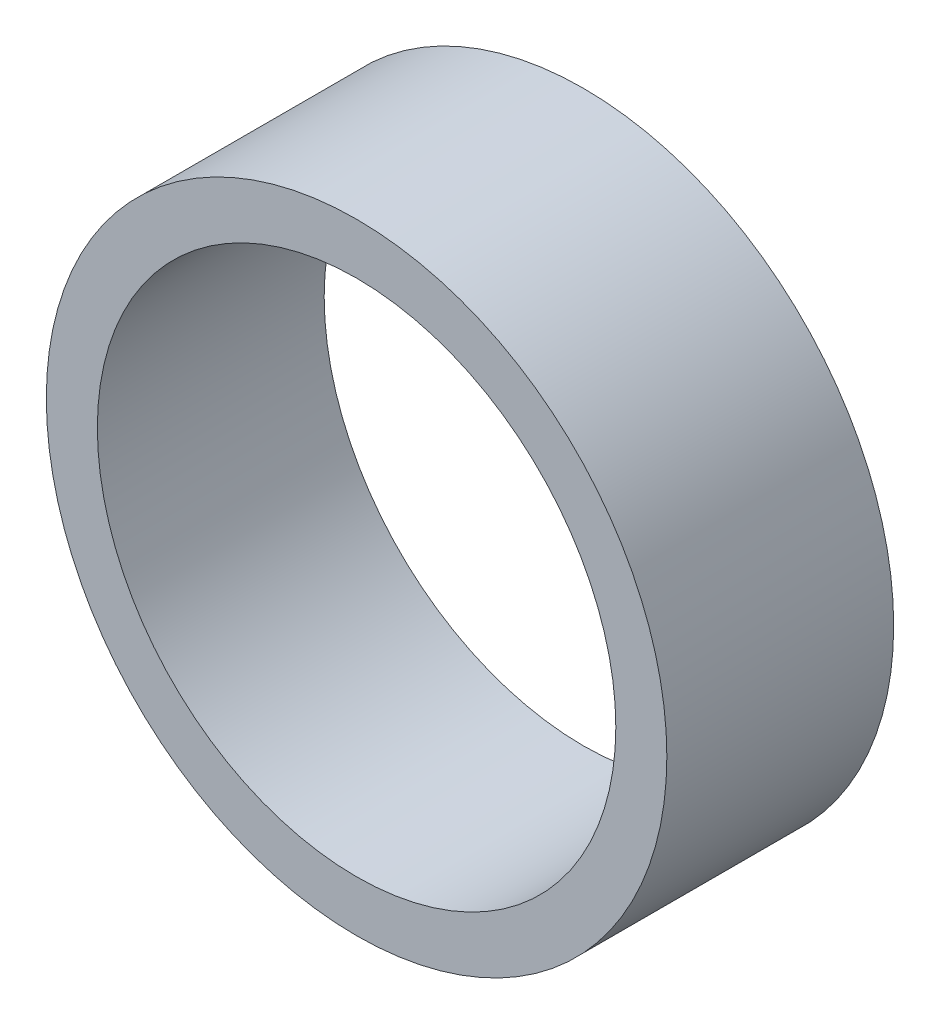
ISO-10303-21;
HEADER;
FILE_DESCRIPTION(('STEP AP214'),'2;1');
FILE_NAME('part.step','',(''),(''),'','','');
FILE_SCHEMA(('AUTOMOTIVE_DESIGN { 1 0 10303 214 1 1 1 1 }'));
ENDSEC;
DATA;
#1=APPLICATION_CONTEXT('core data for automotive mechanical design processes');
#2=APPLICATION_PROTOCOL_DEFINITION('international standard','automotive_design',2000,#1);
#3=PRODUCT_CONTEXT('',#1,'mechanical');
#4=PRODUCT('Part','Part','',(#3));
#5=PRODUCT_RELATED_PRODUCT_CATEGORY('part','',(#4));
#6=PRODUCT_DEFINITION_FORMATION('','',#4);
#7=PRODUCT_DEFINITION_CONTEXT('part definition',#1,'design');
#8=PRODUCT_DEFINITION('design','',#6,#7);
#9=PRODUCT_DEFINITION_SHAPE('','',#8);
#10=(LENGTH_UNIT() NAMED_UNIT(*) SI_UNIT(.MILLI.,.METRE.));
#11=(NAMED_UNIT(*) PLANE_ANGLE_UNIT() SI_UNIT($,.RADIAN.));
#12=(NAMED_UNIT(*) SI_UNIT($,.STERADIAN.) SOLID_ANGLE_UNIT());
#13=UNCERTAINTY_MEASURE_WITH_UNIT(LENGTH_MEASURE(1.E-05),#10,'distance_accuracy_value','');
#14=(GEOMETRIC_REPRESENTATION_CONTEXT(3) GLOBAL_UNCERTAINTY_ASSIGNED_CONTEXT((#13)) GLOBAL_UNIT_ASSIGNED_CONTEXT((#10,
#11,#12)) REPRESENTATION_CONTEXT('',''));
#15=CARTESIAN_POINT('',(0.,0.,0.));
#16=DIRECTION('',(0.,0.,1.));
#17=DIRECTION('',(1.,0.,0.));
#18=AXIS2_PLACEMENT_3D('',#15,#16,#17);
#19=CARTESIAN_POINT('',(0.,0.,17.78));
#20=DIRECTION('',(0.,0.,1.));
#21=DIRECTION('',(1.,0.,0.));
#22=AXIS2_PLACEMENT_3D('',#19,#20,#21);
#23=PLANE('',#22);
#24=CARTESIAN_POINT('',(0.,0.,17.78));
#25=DIRECTION('',(0.,0.,1.));
#26=DIRECTION('',(1.,0.,0.));
#27=AXIS2_PLACEMENT_3D('',#24,#25,#26);
#28=CIRCLE('',#27,24.3205);
#29=CARTESIAN_POINT('',(24.3205,0.,17.78));
#30=VERTEX_POINT('',#29);
#31=EDGE_CURVE('E10',#30,#30,#28,.T.);
#32=ORIENTED_EDGE('',*,*,#31,.T.);
#33=EDGE_LOOP('',(#32));
#34=FACE_BOUND('',#33,.T.);
#35=CARTESIAN_POINT('',(0.,0.,17.78));
#36=DIRECTION('',(0.,0.,1.));
#37=DIRECTION('',(1.,0.,0.));
#38=AXIS2_PLACEMENT_3D('',#35,#36,#37);
#39=CIRCLE('',#38,20.32);
#40=CARTESIAN_POINT('',(20.32,0.,17.78));
#41=VERTEX_POINT('',#40);
#42=EDGE_CURVE('E46',#41,#41,#39,.T.);
#43=ORIENTED_EDGE('',*,*,#42,.F.);
#44=EDGE_LOOP('',(#43));
#45=FACE_BOUND('',#44,.T.);
#46=ADVANCED_FACE('F35',(#34,#45),#23,.T.);
#47=CARTESIAN_POINT('',(0.,0.,0.));
#48=DIRECTION('',(0.,0.,1.));
#49=DIRECTION('',(1.,0.,0.));
#50=AXIS2_PLACEMENT_3D('',#47,#48,#49);
#51=PLANE('',#50);
#52=CARTESIAN_POINT('',(0.,0.,0.));
#53=DIRECTION('',(0.,0.,1.));
#54=DIRECTION('',(1.,0.,0.));
#55=AXIS2_PLACEMENT_3D('',#52,#53,#54);
#56=CIRCLE('',#55,24.3205);
#57=CARTESIAN_POINT('',(24.3205,0.,0.));
#58=VERTEX_POINT('',#57);
#59=EDGE_CURVE('E39',#58,#58,#56,.T.);
#60=ORIENTED_EDGE('',*,*,#59,.F.);
#61=EDGE_LOOP('',(#60));
#62=FACE_BOUND('',#61,.T.);
#63=CARTESIAN_POINT('',(0.,0.,0.));
#64=DIRECTION('',(0.,0.,1.));
#65=DIRECTION('',(1.,0.,0.));
#66=AXIS2_PLACEMENT_3D('',#63,#64,#65);
#67=CIRCLE('',#66,20.32);
#68=CARTESIAN_POINT('',(20.32,0.,0.));
#69=VERTEX_POINT('',#68);
#70=EDGE_CURVE('E48',#69,#69,#67,.T.);
#71=ORIENTED_EDGE('',*,*,#70,.T.);
#72=EDGE_LOOP('',(#71));
#73=FACE_BOUND('',#72,.T.);
#74=ADVANCED_FACE('F58',(#62,#73),#51,.F.);
#75=CARTESIAN_POINT('',(0.,0.,17.78));
#76=DIRECTION('',(0.,0.,-1.));
#77=DIRECTION('',(-1.,0.,0.));
#78=AXIS2_PLACEMENT_3D('',#75,#76,#77);
#79=CYLINDRICAL_SURFACE('',#78,24.3205);
#80=ORIENTED_EDGE('',*,*,#31,.F.);
#81=EDGE_LOOP('',(#80));
#82=FACE_BOUND('',#81,.T.);
#83=ORIENTED_EDGE('',*,*,#59,.T.);
#84=EDGE_LOOP('',(#83));
#85=FACE_BOUND('',#84,.T.);
#86=ADVANCED_FACE('F37',(#82,#85),#79,.T.);
#87=CARTESIAN_POINT('',(0.,0.,17.78));
#88=DIRECTION('',(0.,0.,-1.));
#89=DIRECTION('',(-1.,0.,0.));
#90=AXIS2_PLACEMENT_3D('',#87,#88,#89);
#91=CYLINDRICAL_SURFACE('',#90,20.32);
#92=ORIENTED_EDGE('',*,*,#42,.T.);
#93=EDGE_LOOP('',(#92));
#94=FACE_BOUND('',#93,.T.);
#95=ORIENTED_EDGE('',*,*,#70,.F.);
#96=EDGE_LOOP('',(#95));
#97=FACE_BOUND('',#96,.T.);
#98=ADVANCED_FACE('F54',(#94,#97),#91,.F.);
#99=CLOSED_SHELL('',(#46,#74,#86,#98));
#100=MANIFOLD_SOLID_BREP('B2',#99);
#101=ADVANCED_BREP_SHAPE_REPRESENTATION('',(#18,#100),#14);
#102=SHAPE_DEFINITION_REPRESENTATION(#9,#101);
ENDSEC;
END-ISO-10303-21;
